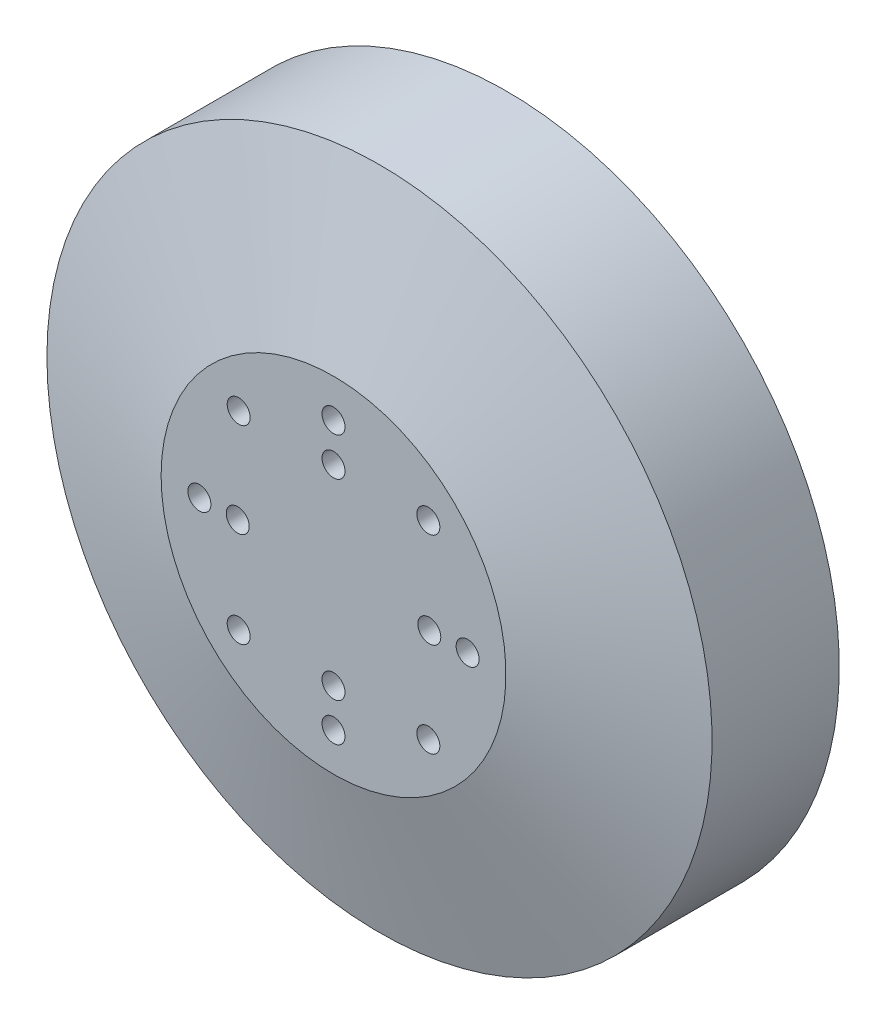
ISO-10303-21;
HEADER;
FILE_DESCRIPTION(('STEP AP214'),'2;1');
FILE_NAME('part.step','',(''),(''),'','','');
FILE_SCHEMA(('AUTOMOTIVE_DESIGN { 1 0 10303 214 1 1 1 1 }'));
ENDSEC;
DATA;
#1=APPLICATION_CONTEXT('core data for automotive mechanical design processes');
#2=APPLICATION_PROTOCOL_DEFINITION('international standard','automotive_design',2000,#1);
#3=PRODUCT_CONTEXT('',#1,'mechanical');
#4=PRODUCT('Part','Part','',(#3));
#5=PRODUCT_RELATED_PRODUCT_CATEGORY('part','',(#4));
#6=PRODUCT_DEFINITION_FORMATION('','',#4);
#7=PRODUCT_DEFINITION_CONTEXT('part definition',#1,'design');
#8=PRODUCT_DEFINITION('design','',#6,#7);
#9=PRODUCT_DEFINITION_SHAPE('','',#8);
#10=(LENGTH_UNIT() NAMED_UNIT(*) SI_UNIT(.MILLI.,.METRE.));
#11=(NAMED_UNIT(*) PLANE_ANGLE_UNIT() SI_UNIT($,.RADIAN.));
#12=(NAMED_UNIT(*) SI_UNIT($,.STERADIAN.) SOLID_ANGLE_UNIT());
#13=UNCERTAINTY_MEASURE_WITH_UNIT(LENGTH_MEASURE(1.E-05),#10,'distance_accuracy_value','');
#14=(GEOMETRIC_REPRESENTATION_CONTEXT(3) GLOBAL_UNCERTAINTY_ASSIGNED_CONTEXT((#13)) GLOBAL_UNIT_ASSIGNED_CONTEXT((#10,
#11,#12)) REPRESENTATION_CONTEXT('',''));
#15=CARTESIAN_POINT('',(0.,0.,0.));
#16=DIRECTION('',(0.,0.,1.));
#17=DIRECTION('',(1.,0.,0.));
#18=AXIS2_PLACEMENT_3D('',#15,#16,#17);
#19=CARTESIAN_POINT('',(-40.4,0.,-9.29999999999999));
#20=DIRECTION('',(0.,0.,1.));
#21=DIRECTION('',(1.,0.,0.));
#22=AXIS2_PLACEMENT_3D('',#19,#20,#21);
#23=PLANE('',#22);
#24=CARTESIAN_POINT('',(0.,0.,-9.29999999999999));
#25=DIRECTION('',(0.,0.,-1.));
#26=DIRECTION('',(-1.,0.,0.));
#27=AXIS2_PLACEMENT_3D('',#24,#25,#26);
#28=CIRCLE('',#27,40.4);
#29=CARTESIAN_POINT('',(-40.4,0.,-9.29999999999999));
#30=VERTEX_POINT('',#29);
#31=EDGE_CURVE('E47',#30,#30,#28,.T.);
#32=ORIENTED_EDGE('',*,*,#31,.F.);
#33=EDGE_LOOP('',(#32));
#34=FACE_BOUND('',#33,.T.);
#35=CARTESIAN_POINT('',(0.,0.,-9.29999999999999));
#36=DIRECTION('',(0.,0.,-1.));
#37=DIRECTION('',(-1.,0.,0.));
#38=AXIS2_PLACEMENT_3D('',#35,#36,#37);
#39=CIRCLE('',#38,43.4);
#40=CARTESIAN_POINT('',(-43.4,0.,-9.29999999999999));
#41=VERTEX_POINT('',#40);
#42=EDGE_CURVE('E35',#41,#41,#39,.T.);
#43=ORIENTED_EDGE('',*,*,#42,.T.);
#44=EDGE_LOOP('',(#43));
#45=FACE_BOUND('',#44,.T.);
#46=ADVANCED_FACE('F31',(#34,#45),#23,.F.);
#47=CARTESIAN_POINT('',(0.,0.,-10.8));
#48=DIRECTION('',(0.,0.,1.));
#49=DIRECTION('',(1.,0.,0.));
#50=AXIS2_PLACEMENT_3D('',#47,#48,#49);
#51=CONICAL_SURFACE('',#50,40.4,1.44885532876603);
#52=CARTESIAN_POINT('',(0.,0.,-13.3));
#53=DIRECTION('',(0.,0.,-1.));
#54=DIRECTION('',(-1.,0.,0.));
#55=AXIS2_PLACEMENT_3D('',#52,#53,#54);
#56=CIRCLE('',#55,20.);
#57=CARTESIAN_POINT('',(-20.,0.,-13.3));
#58=VERTEX_POINT('',#57);
#59=EDGE_CURVE('E53',#58,#58,#56,.T.);
#60=ORIENTED_EDGE('',*,*,#59,.F.);
#61=EDGE_LOOP('',(#60));
#62=FACE_BOUND('',#61,.T.);
#63=CARTESIAN_POINT('',(0.,0.,-10.8));
#64=DIRECTION('',(0.,0.,-1.));
#65=DIRECTION('',(-1.,0.,0.));
#66=AXIS2_PLACEMENT_3D('',#63,#64,#65);
#67=CIRCLE('',#66,40.4);
#68=CARTESIAN_POINT('',(-40.4,0.,-10.8));
#69=VERTEX_POINT('',#68);
#70=EDGE_CURVE('E50',#69,#69,#67,.T.);
#71=ORIENTED_EDGE('',*,*,#70,.T.);
#72=EDGE_LOOP('',(#71));
#73=FACE_BOUND('',#72,.T.);
#74=ADVANCED_FACE('F75',(#62,#73),#51,.T.);
#75=CARTESIAN_POINT('',(0.,0.,-13.3));
#76=DIRECTION('',(0.,0.,-1.));
#77=DIRECTION('',(-1.,0.,0.));
#78=AXIS2_PLACEMENT_3D('',#75,#76,#77);
#79=CYLINDRICAL_SURFACE('',#78,40.4);
#80=ORIENTED_EDGE('',*,*,#70,.F.);
#81=EDGE_LOOP('',(#80));
#82=FACE_BOUND('',#81,.T.);
#83=ORIENTED_EDGE('',*,*,#31,.T.);
#84=EDGE_LOOP('',(#83));
#85=FACE_BOUND('',#84,.T.);
#86=ADVANCED_FACE('F72',(#82,#85),#79,.T.);
#87=CARTESIAN_POINT('',(0.,0.,-13.3));
#88=DIRECTION('',(0.,0.,1.));
#89=DIRECTION('',(1.,0.,0.));
#90=AXIS2_PLACEMENT_3D('',#87,#88,#89);
#91=PLANE('',#90);
#92=CARTESIAN_POINT('',(-10.6066017177982,-10.6066017177982,-13.3));
#93=DIRECTION('',(0.,0.,-1.));
#94=DIRECTION('',(-1.,0.,0.));
#95=AXIS2_PLACEMENT_3D('',#92,#93,#94);
#96=CIRCLE('',#95,1.5);
#97=CARTESIAN_POINT('',(-12.1066017177982,-10.6066017177982,-13.3));
#98=VERTEX_POINT('',#97);
#99=EDGE_CURVE('E194',#98,#98,#96,.T.);
#100=ORIENTED_EDGE('',*,*,#99,.F.);
#101=EDGE_LOOP('',(#100));
#102=FACE_BOUND('',#101,.T.);
#103=CARTESIAN_POINT('',(10.6066017177982,-10.6066017177982,-13.3));
#104=DIRECTION('',(0.,0.,-1.));
#105=DIRECTION('',(-1.,0.,0.));
#106=AXIS2_PLACEMENT_3D('',#103,#104,#105);
#107=CIRCLE('',#106,1.5);
#108=CARTESIAN_POINT('',(9.10660171779821,-10.6066017177982,-13.3));
#109=VERTEX_POINT('',#108);
#110=EDGE_CURVE('E200',#109,#109,#107,.T.);
#111=ORIENTED_EDGE('',*,*,#110,.F.);
#112=EDGE_LOOP('',(#111));
#113=FACE_BOUND('',#112,.T.);
#114=CARTESIAN_POINT('',(10.6066017177982,10.6066017177982,-13.3));
#115=DIRECTION('',(0.,0.,-1.));
#116=DIRECTION('',(-1.,0.,0.));
#117=AXIS2_PLACEMENT_3D('',#114,#115,#116);
#118=CIRCLE('',#117,1.5);
#119=CARTESIAN_POINT('',(9.10660171779821,10.6066017177982,-13.3));
#120=VERTEX_POINT('',#119);
#121=EDGE_CURVE('E206',#120,#120,#118,.T.);
#122=ORIENTED_EDGE('',*,*,#121,.F.);
#123=EDGE_LOOP('',(#122));
#124=FACE_BOUND('',#123,.T.);
#125=CARTESIAN_POINT('',(0.,16.,-13.3));
#126=DIRECTION('',(0.,0.,-1.));
#127=DIRECTION('',(-1.,0.,0.));
#128=AXIS2_PLACEMENT_3D('',#125,#126,#127);
#129=CIRCLE('',#128,2.);
#130=CARTESIAN_POINT('',(-2.,16.,-13.3));
#131=VERTEX_POINT('',#130);
#132=EDGE_CURVE('E173',#131,#131,#129,.T.);
#133=ORIENTED_EDGE('',*,*,#132,.F.);
#134=EDGE_LOOP('',(#133));
#135=FACE_BOUND('',#134,.T.);
#136=CARTESIAN_POINT('',(-16.,0.,-13.3));
#137=DIRECTION('',(0.,0.,-1.));
#138=DIRECTION('',(-1.,0.,0.));
#139=AXIS2_PLACEMENT_3D('',#136,#137,#138);
#140=CIRCLE('',#139,2.);
#141=CARTESIAN_POINT('',(-18.,0.,-13.3));
#142=VERTEX_POINT('',#141);
#143=EDGE_CURVE('E174',#142,#142,#140,.T.);
#144=ORIENTED_EDGE('',*,*,#143,.F.);
#145=EDGE_LOOP('',(#144));
#146=FACE_BOUND('',#145,.T.);
#147=CARTESIAN_POINT('',(0.,-16.,-13.3));
#148=DIRECTION('',(0.,0.,-1.));
#149=DIRECTION('',(-1.,0.,0.));
#150=AXIS2_PLACEMENT_3D('',#147,#148,#149);
#151=CIRCLE('',#150,2.);
#152=CARTESIAN_POINT('',(-2.,-16.,-13.3));
#153=VERTEX_POINT('',#152);
#154=EDGE_CURVE('E180',#153,#153,#151,.T.);
#155=ORIENTED_EDGE('',*,*,#154,.F.);
#156=EDGE_LOOP('',(#155));
#157=FACE_BOUND('',#156,.T.);
#158=CARTESIAN_POINT('',(16.,0.,-13.3));
#159=DIRECTION('',(0.,0.,-1.));
#160=DIRECTION('',(-1.,0.,0.));
#161=AXIS2_PLACEMENT_3D('',#158,#159,#160);
#162=CIRCLE('',#161,2.);
#163=CARTESIAN_POINT('',(14.,0.,-13.3));
#164=VERTEX_POINT('',#163);
#165=EDGE_CURVE('E186',#164,#164,#162,.T.);
#166=ORIENTED_EDGE('',*,*,#165,.F.);
#167=EDGE_LOOP('',(#166));
#168=FACE_BOUND('',#167,.T.);
#169=CARTESIAN_POINT('',(-10.6066017177982,10.6066017177982,-13.3));
#170=DIRECTION('',(0.,0.,-1.));
#171=DIRECTION('',(-1.,0.,0.));
#172=AXIS2_PLACEMENT_3D('',#169,#170,#171);
#173=CIRCLE('',#172,1.5);
#174=CARTESIAN_POINT('',(-12.1066017177982,10.6066017177982,-13.3));
#175=VERTEX_POINT('',#174);
#176=EDGE_CURVE('E193',#175,#175,#173,.T.);
#177=ORIENTED_EDGE('',*,*,#176,.F.);
#178=EDGE_LOOP('',(#177));
#179=FACE_BOUND('',#178,.T.);
#180=ORIENTED_EDGE('',*,*,#59,.T.);
#181=EDGE_LOOP('',(#180));
#182=FACE_BOUND('',#181,.T.);
#183=ADVANCED_FACE('F63',(#102,#113,#124,#135,#146,#157,#168,#179,#182),#91,.F.);
#184=CARTESIAN_POINT('',(0.,0.,13.3));
#185=DIRECTION('',(0.,0.,-1.));
#186=DIRECTION('',(-1.,0.,0.));
#187=AXIS2_PLACEMENT_3D('',#184,#185,#186);
#188=CYLINDRICAL_SURFACE('',#187,43.4);
#189=CARTESIAN_POINT('',(0.,0.,7.3));
#190=DIRECTION('',(0.,0.,-1.));
#191=DIRECTION('',(-1.,0.,0.));
#192=AXIS2_PLACEMENT_3D('',#189,#190,#191);
#193=CIRCLE('',#192,43.4);
#194=CARTESIAN_POINT('',(-43.4,0.,7.3));
#195=VERTEX_POINT('',#194);
#196=EDGE_CURVE('E39',#195,#195,#193,.T.);
#197=ORIENTED_EDGE('',*,*,#196,.T.);
#198=EDGE_LOOP('',(#197));
#199=FACE_BOUND('',#198,.T.);
#200=ORIENTED_EDGE('',*,*,#42,.F.);
#201=EDGE_LOOP('',(#200));
#202=FACE_BOUND('',#201,.T.);
#203=ADVANCED_FACE('F33',(#199,#202),#188,.T.);
#204=CARTESIAN_POINT('',(0.,0.,13.3));
#205=DIRECTION('',(0.,0.,-1.));
#206=DIRECTION('',(-1.,0.,0.));
#207=AXIS2_PLACEMENT_3D('',#204,#205,#206);
#208=CONICAL_SURFACE('',#207,22.5,1.29123324458332);
#209=ORIENTED_EDGE('',*,*,#196,.F.);
#210=EDGE_LOOP('',(#209));
#211=FACE_BOUND('',#210,.T.);
#212=CARTESIAN_POINT('',(0.,0.,13.3));
#213=DIRECTION('',(0.,0.,-1.));
#214=DIRECTION('',(-1.,0.,0.));
#215=AXIS2_PLACEMENT_3D('',#212,#213,#214);
#216=CIRCLE('',#215,22.5);
#217=CARTESIAN_POINT('',(-22.5,0.,13.3));
#218=VERTEX_POINT('',#217);
#219=EDGE_CURVE('E10',#218,#218,#216,.T.);
#220=ORIENTED_EDGE('',*,*,#219,.T.);
#221=EDGE_LOOP('',(#220));
#222=FACE_BOUND('',#221,.T.);
#223=ADVANCED_FACE('F62',(#211,#222),#208,.T.);
#224=CARTESIAN_POINT('',(0.,0.,13.3));
#225=DIRECTION('',(0.,0.,1.));
#226=DIRECTION('',(1.,0.,0.));
#227=AXIS2_PLACEMENT_3D('',#224,#225,#226);
#228=PLANE('',#227);
#229=CARTESIAN_POINT('',(0.,17.5,13.3));
#230=DIRECTION('',(0.,0.,1.));
#231=DIRECTION('',(1.,0.,0.));
#232=AXIS2_PLACEMENT_3D('',#229,#230,#231);
#233=CIRCLE('',#232,1.5);
#234=CARTESIAN_POINT('',(1.5,17.5,13.3));
#235=VERTEX_POINT('',#234);
#236=EDGE_CURVE('E98',#235,#235,#233,.T.);
#237=ORIENTED_EDGE('',*,*,#236,.F.);
#238=EDGE_LOOP('',(#237));
#239=FACE_BOUND('',#238,.T.);
#240=CARTESIAN_POINT('',(-12.5,0.,13.3));
#241=DIRECTION('',(0.,0.,1.));
#242=DIRECTION('',(1.,0.,0.));
#243=AXIS2_PLACEMENT_3D('',#240,#241,#242);
#244=CIRCLE('',#243,1.50000000000023);
#245=CARTESIAN_POINT('',(-10.9999999999998,0.,13.3));
#246=VERTEX_POINT('',#245);
#247=EDGE_CURVE('E102',#246,#246,#244,.T.);
#248=ORIENTED_EDGE('',*,*,#247,.F.);
#249=EDGE_LOOP('',(#248));
#250=FACE_BOUND('',#249,.T.);
#251=CARTESIAN_POINT('',(0.,-12.5,13.3));
#252=DIRECTION('',(0.,0.,1.));
#253=DIRECTION('',(1.,0.,0.));
#254=AXIS2_PLACEMENT_3D('',#251,#252,#253);
#255=CIRCLE('',#254,1.50000000000068);
#256=CARTESIAN_POINT('',(1.50000000000068,-12.5,13.3));
#257=VERTEX_POINT('',#256);
#258=EDGE_CURVE('E106',#257,#257,#255,.T.);
#259=ORIENTED_EDGE('',*,*,#258,.F.);
#260=EDGE_LOOP('',(#259));
#261=FACE_BOUND('',#260,.T.);
#262=CARTESIAN_POINT('',(12.5,0.,13.3));
#263=DIRECTION('',(0.,0.,1.));
#264=DIRECTION('',(1.,0.,0.));
#265=AXIS2_PLACEMENT_3D('',#262,#263,#264);
#266=CIRCLE('',#265,1.50000000000044);
#267=CARTESIAN_POINT('',(14.0000000000004,0.,13.3));
#268=VERTEX_POINT('',#267);
#269=EDGE_CURVE('E110',#268,#268,#266,.T.);
#270=ORIENTED_EDGE('',*,*,#269,.F.);
#271=EDGE_LOOP('',(#270));
#272=FACE_BOUND('',#271,.T.);
#273=CARTESIAN_POINT('',(0.,12.5,13.3));
#274=DIRECTION('',(0.,0.,1.));
#275=DIRECTION('',(1.,0.,0.));
#276=AXIS2_PLACEMENT_3D('',#273,#274,#275);
#277=CIRCLE('',#276,1.5);
#278=CARTESIAN_POINT('',(1.5,12.5,13.3));
#279=VERTEX_POINT('',#278);
#280=EDGE_CURVE('E114',#279,#279,#277,.T.);
#281=ORIENTED_EDGE('',*,*,#280,.F.);
#282=EDGE_LOOP('',(#281));
#283=FACE_BOUND('',#282,.T.);
#284=CARTESIAN_POINT('',(12.3743686707646,12.3743686707646,13.3));
#285=DIRECTION('',(0.,0.,1.));
#286=DIRECTION('',(1.,0.,0.));
#287=AXIS2_PLACEMENT_3D('',#284,#285,#286);
#288=CIRCLE('',#287,1.50000000000036);
#289=CARTESIAN_POINT('',(13.8743686707649,12.3743686707646,13.3));
#290=VERTEX_POINT('',#289);
#291=EDGE_CURVE('E118',#290,#290,#288,.T.);
#292=ORIENTED_EDGE('',*,*,#291,.F.);
#293=EDGE_LOOP('',(#292));
#294=FACE_BOUND('',#293,.T.);
#295=CARTESIAN_POINT('',(17.5,0.,13.3));
#296=DIRECTION('',(0.,0.,1.));
#297=DIRECTION('',(1.,0.,0.));
#298=AXIS2_PLACEMENT_3D('',#295,#296,#297);
#299=CIRCLE('',#298,1.50000000000093);
#300=CARTESIAN_POINT('',(19.0000000000009,0.,13.3));
#301=VERTEX_POINT('',#300);
#302=EDGE_CURVE('E122',#301,#301,#299,.T.);
#303=ORIENTED_EDGE('',*,*,#302,.F.);
#304=EDGE_LOOP('',(#303));
#305=FACE_BOUND('',#304,.T.);
#306=CARTESIAN_POINT('',(12.3743686707646,-12.3743686707646,13.3));
#307=DIRECTION('',(0.,0.,1.));
#308=DIRECTION('',(1.,0.,0.));
#309=AXIS2_PLACEMENT_3D('',#306,#307,#308);
#310=CIRCLE('',#309,1.50000000000136);
#311=CARTESIAN_POINT('',(13.8743686707659,-12.3743686707646,13.3));
#312=VERTEX_POINT('',#311);
#313=EDGE_CURVE('E126',#312,#312,#310,.T.);
#314=ORIENTED_EDGE('',*,*,#313,.F.);
#315=EDGE_LOOP('',(#314));
#316=FACE_BOUND('',#315,.T.);
#317=CARTESIAN_POINT('',(0.,-17.5,13.3));
#318=DIRECTION('',(0.,0.,1.));
#319=DIRECTION('',(1.,0.,0.));
#320=AXIS2_PLACEMENT_3D('',#317,#318,#319);
#321=CIRCLE('',#320,1.50000000000142);
#322=CARTESIAN_POINT('',(1.50000000000142,-17.5,13.3));
#323=VERTEX_POINT('',#322);
#324=EDGE_CURVE('E130',#323,#323,#321,.T.);
#325=ORIENTED_EDGE('',*,*,#324,.F.);
#326=EDGE_LOOP('',(#325));
#327=FACE_BOUND('',#326,.T.);
#328=CARTESIAN_POINT('',(-12.3743686707646,-12.3743686707646,13.3));
#329=DIRECTION('',(0.,0.,1.));
#330=DIRECTION('',(1.,0.,0.));
#331=AXIS2_PLACEMENT_3D('',#328,#329,#330);
#332=CIRCLE('',#331,1.50000000000106);
#333=CARTESIAN_POINT('',(-10.8743686707635,-12.3743686707646,13.3));
#334=VERTEX_POINT('',#333);
#335=EDGE_CURVE('E134',#334,#334,#332,.T.);
#336=ORIENTED_EDGE('',*,*,#335,.F.);
#337=EDGE_LOOP('',(#336));
#338=FACE_BOUND('',#337,.T.);
#339=CARTESIAN_POINT('',(-17.5,0.,13.3));
#340=DIRECTION('',(0.,0.,1.));
#341=DIRECTION('',(1.,0.,0.));
#342=AXIS2_PLACEMENT_3D('',#339,#340,#341);
#343=CIRCLE('',#342,1.50000000000049);
#344=CARTESIAN_POINT('',(-15.9999999999995,0.,13.3));
#345=VERTEX_POINT('',#344);
#346=EDGE_CURVE('E138',#345,#345,#343,.T.);
#347=ORIENTED_EDGE('',*,*,#346,.F.);
#348=EDGE_LOOP('',(#347));
#349=FACE_BOUND('',#348,.T.);
#350=CARTESIAN_POINT('',(-12.3743686707646,12.3743686707646,13.3));
#351=DIRECTION('',(0.,0.,1.));
#352=DIRECTION('',(1.,0.,0.));
#353=AXIS2_PLACEMENT_3D('',#350,#351,#352);
#354=CIRCLE('',#353,1.50000000000006);
#355=CARTESIAN_POINT('',(-10.8743686707645,12.3743686707646,13.3));
#356=VERTEX_POINT('',#355);
#357=EDGE_CURVE('E142',#356,#356,#354,.T.);
#358=ORIENTED_EDGE('',*,*,#357,.F.);
#359=EDGE_LOOP('',(#358));
#360=FACE_BOUND('',#359,.T.);
#361=ORIENTED_EDGE('',*,*,#219,.F.);
#362=EDGE_LOOP('',(#361));
#363=FACE_BOUND('',#362,.T.);
#364=ADVANCED_FACE('F69',(#239,#250,#261,#272,#283,#294,#305,#316,#327,#338,#349,#360,#363),
#228,.T.);
#365=CARTESIAN_POINT('',(-10.6066017177982,10.6066017177982,-3.3));
#366=DIRECTION('',(0.,0.,-1.));
#367=DIRECTION('',(-1.,0.,0.));
#368=AXIS2_PLACEMENT_3D('',#365,#366,#367);
#369=CYLINDRICAL_SURFACE('',#368,1.5);
#370=CARTESIAN_POINT('',(-10.6066017177982,10.6066017177982,-3.3));
#371=DIRECTION('',(0.,0.,-1.));
#372=DIRECTION('',(-1.,0.,0.));
#373=AXIS2_PLACEMENT_3D('',#370,#371,#372);
#374=CIRCLE('',#373,1.5);
#375=CARTESIAN_POINT('',(-12.1066017177982,10.6066017177982,-3.3));
#376=VERTEX_POINT('',#375);
#377=EDGE_CURVE('E51',#376,#376,#374,.T.);
#378=ORIENTED_EDGE('',*,*,#377,.F.);
#379=EDGE_LOOP('',(#378));
#380=FACE_BOUND('',#379,.T.);
#381=ORIENTED_EDGE('',*,*,#176,.T.);
#382=EDGE_LOOP('',(#381));
#383=FACE_BOUND('',#382,.T.);
#384=ADVANCED_FACE('F87',(#380,#383),#369,.F.);
#385=CARTESIAN_POINT('',(-10.6066017177982,10.6066017177982,-3.3));
#386=DIRECTION('',(0.,0.,-1.));
#387=DIRECTION('',(-1.,0.,0.));
#388=AXIS2_PLACEMENT_3D('',#385,#386,#387);
#389=PLANE('',#388);
#390=ORIENTED_EDGE('',*,*,#377,.T.);
#391=EDGE_LOOP('',(#390));
#392=FACE_BOUND('',#391,.T.);
#393=ADVANCED_FACE('F92',(#392),#389,.T.);
#394=CARTESIAN_POINT('',(16.,0.,-3.3));
#395=DIRECTION('',(0.,0.,-1.));
#396=DIRECTION('',(-1.,0.,0.));
#397=AXIS2_PLACEMENT_3D('',#394,#395,#396);
#398=CYLINDRICAL_SURFACE('',#397,2.);
#399=CARTESIAN_POINT('',(16.,0.,-3.3));
#400=DIRECTION('',(0.,0.,-1.));
#401=DIRECTION('',(-1.,0.,0.));
#402=AXIS2_PLACEMENT_3D('',#399,#400,#401);
#403=CIRCLE('',#402,2.);
#404=CARTESIAN_POINT('',(14.,0.,-3.3));
#405=VERTEX_POINT('',#404);
#406=EDGE_CURVE('E183',#405,#405,#403,.T.);
#407=ORIENTED_EDGE('',*,*,#406,.F.);
#408=EDGE_LOOP('',(#407));
#409=FACE_BOUND('',#408,.T.);
#410=ORIENTED_EDGE('',*,*,#165,.T.);
#411=EDGE_LOOP('',(#410));
#412=FACE_BOUND('',#411,.T.);
#413=ADVANCED_FACE('F222',(#409,#412),#398,.F.);
#414=CARTESIAN_POINT('',(16.,0.,-3.3));
#415=DIRECTION('',(0.,0.,-1.));
#416=DIRECTION('',(-1.,0.,0.));
#417=AXIS2_PLACEMENT_3D('',#414,#415,#416);
#418=PLANE('',#417);
#419=ORIENTED_EDGE('',*,*,#406,.T.);
#420=EDGE_LOOP('',(#419));
#421=FACE_BOUND('',#420,.T.);
#422=ADVANCED_FACE('F227',(#421),#418,.T.);
#423=CARTESIAN_POINT('',(0.,-16.,-3.3));
#424=DIRECTION('',(0.,0.,-1.));
#425=DIRECTION('',(-1.,0.,0.));
#426=AXIS2_PLACEMENT_3D('',#423,#424,#425);
#427=CYLINDRICAL_SURFACE('',#426,2.);
#428=CARTESIAN_POINT('',(0.,-16.,-3.3));
#429=DIRECTION('',(0.,0.,-1.));
#430=DIRECTION('',(-1.,0.,0.));
#431=AXIS2_PLACEMENT_3D('',#428,#429,#430);
#432=CIRCLE('',#431,2.);
#433=CARTESIAN_POINT('',(-2.,-16.,-3.3));
#434=VERTEX_POINT('',#433);
#435=EDGE_CURVE('E177',#434,#434,#432,.T.);
#436=ORIENTED_EDGE('',*,*,#435,.F.);
#437=EDGE_LOOP('',(#436));
#438=FACE_BOUND('',#437,.T.);
#439=ORIENTED_EDGE('',*,*,#154,.T.);
#440=EDGE_LOOP('',(#439));
#441=FACE_BOUND('',#440,.T.);
#442=ADVANCED_FACE('F276',(#438,#441),#427,.F.);
#443=CARTESIAN_POINT('',(0.,-16.,-3.3));
#444=DIRECTION('',(0.,0.,-1.));
#445=DIRECTION('',(-1.,0.,0.));
#446=AXIS2_PLACEMENT_3D('',#443,#444,#445);
#447=PLANE('',#446);
#448=ORIENTED_EDGE('',*,*,#435,.T.);
#449=EDGE_LOOP('',(#448));
#450=FACE_BOUND('',#449,.T.);
#451=ADVANCED_FACE('F286',(#450),#447,.T.);
#452=CARTESIAN_POINT('',(-16.,0.,-3.3));
#453=DIRECTION('',(0.,0.,-1.));
#454=DIRECTION('',(-1.,0.,0.));
#455=AXIS2_PLACEMENT_3D('',#452,#453,#454);
#456=CYLINDRICAL_SURFACE('',#455,2.);
#457=CARTESIAN_POINT('',(-16.,0.,-3.3));
#458=DIRECTION('',(0.,0.,-1.));
#459=DIRECTION('',(-1.,0.,0.));
#460=AXIS2_PLACEMENT_3D('',#457,#458,#459);
#461=CIRCLE('',#460,2.);
#462=CARTESIAN_POINT('',(-18.,0.,-3.3));
#463=VERTEX_POINT('',#462);
#464=EDGE_CURVE('E170',#463,#463,#461,.T.);
#465=ORIENTED_EDGE('',*,*,#464,.F.);
#466=EDGE_LOOP('',(#465));
#467=FACE_BOUND('',#466,.T.);
#468=ORIENTED_EDGE('',*,*,#143,.T.);
#469=EDGE_LOOP('',(#468));
#470=FACE_BOUND('',#469,.T.);
#471=ADVANCED_FACE('F296',(#467,#470),#456,.F.);
#472=CARTESIAN_POINT('',(-16.,0.,-3.3));
#473=DIRECTION('',(0.,0.,-1.));
#474=DIRECTION('',(-1.,0.,0.));
#475=AXIS2_PLACEMENT_3D('',#472,#473,#474);
#476=PLANE('',#475);
#477=ORIENTED_EDGE('',*,*,#464,.T.);
#478=EDGE_LOOP('',(#477));
#479=FACE_BOUND('',#478,.T.);
#480=ADVANCED_FACE('F306',(#479),#476,.T.);
#481=CARTESIAN_POINT('',(0.,16.,-3.3));
#482=DIRECTION('',(0.,0.,-1.));
#483=DIRECTION('',(-1.,0.,0.));
#484=AXIS2_PLACEMENT_3D('',#481,#482,#483);
#485=CYLINDRICAL_SURFACE('',#484,2.);
#486=CARTESIAN_POINT('',(0.,16.,-3.3));
#487=DIRECTION('',(0.,0.,-1.));
#488=DIRECTION('',(-1.,0.,0.));
#489=AXIS2_PLACEMENT_3D('',#486,#487,#488);
#490=CIRCLE('',#489,2.);
#491=CARTESIAN_POINT('',(-2.,16.,-3.3));
#492=VERTEX_POINT('',#491);
#493=EDGE_CURVE('E209',#492,#492,#490,.T.);
#494=ORIENTED_EDGE('',*,*,#493,.F.);
#495=EDGE_LOOP('',(#494));
#496=FACE_BOUND('',#495,.T.);
#497=ORIENTED_EDGE('',*,*,#132,.T.);
#498=EDGE_LOOP('',(#497));
#499=FACE_BOUND('',#498,.T.);
#500=ADVANCED_FACE('F231',(#496,#499),#485,.F.);
#501=CARTESIAN_POINT('',(0.,16.,-3.3));
#502=DIRECTION('',(0.,0.,-1.));
#503=DIRECTION('',(-1.,0.,0.));
#504=AXIS2_PLACEMENT_3D('',#501,#502,#503);
#505=PLANE('',#504);
#506=ORIENTED_EDGE('',*,*,#493,.T.);
#507=EDGE_LOOP('',(#506));
#508=FACE_BOUND('',#507,.T.);
#509=ADVANCED_FACE('F325',(#508),#505,.T.);
#510=CARTESIAN_POINT('',(10.6066017177982,10.6066017177982,-3.3));
#511=DIRECTION('',(0.,0.,-1.));
#512=DIRECTION('',(-1.,0.,0.));
#513=AXIS2_PLACEMENT_3D('',#510,#511,#512);
#514=CYLINDRICAL_SURFACE('',#513,1.5);
#515=CARTESIAN_POINT('',(10.6066017177982,10.6066017177982,-3.3));
#516=DIRECTION('',(0.,0.,-1.));
#517=DIRECTION('',(-1.,0.,0.));
#518=AXIS2_PLACEMENT_3D('',#515,#516,#517);
#519=CIRCLE('',#518,1.5);
#520=CARTESIAN_POINT('',(9.10660171779821,10.6066017177982,-3.3));
#521=VERTEX_POINT('',#520);
#522=EDGE_CURVE('E203',#521,#521,#519,.T.);
#523=ORIENTED_EDGE('',*,*,#522,.F.);
#524=EDGE_LOOP('',(#523));
#525=FACE_BOUND('',#524,.T.);
#526=ORIENTED_EDGE('',*,*,#121,.T.);
#527=EDGE_LOOP('',(#526));
#528=FACE_BOUND('',#527,.T.);
#529=ADVANCED_FACE('F334',(#525,#528),#514,.F.);
#530=CARTESIAN_POINT('',(10.6066017177982,10.6066017177982,-3.3));
#531=DIRECTION('',(0.,0.,-1.));
#532=DIRECTION('',(-1.,0.,0.));
#533=AXIS2_PLACEMENT_3D('',#530,#531,#532);
#534=PLANE('',#533);
#535=ORIENTED_EDGE('',*,*,#522,.T.);
#536=EDGE_LOOP('',(#535));
#537=FACE_BOUND('',#536,.T.);
#538=ADVANCED_FACE('F343',(#537),#534,.T.);
#539=CARTESIAN_POINT('',(10.6066017177982,-10.6066017177982,-3.3));
#540=DIRECTION('',(0.,0.,-1.));
#541=DIRECTION('',(-1.,0.,0.));
#542=AXIS2_PLACEMENT_3D('',#539,#540,#541);
#543=CYLINDRICAL_SURFACE('',#542,1.5);
#544=CARTESIAN_POINT('',(10.6066017177982,-10.6066017177982,-3.3));
#545=DIRECTION('',(0.,0.,-1.));
#546=DIRECTION('',(-1.,0.,0.));
#547=AXIS2_PLACEMENT_3D('',#544,#545,#546);
#548=CIRCLE('',#547,1.5);
#549=CARTESIAN_POINT('',(9.10660171779821,-10.6066017177982,-3.3));
#550=VERTEX_POINT('',#549);
#551=EDGE_CURVE('E197',#550,#550,#548,.T.);
#552=ORIENTED_EDGE('',*,*,#551,.F.);
#553=EDGE_LOOP('',(#552));
#554=FACE_BOUND('',#553,.T.);
#555=ORIENTED_EDGE('',*,*,#110,.T.);
#556=EDGE_LOOP('',(#555));
#557=FACE_BOUND('',#556,.T.);
#558=ADVANCED_FACE('F353',(#554,#557),#543,.F.);
#559=CARTESIAN_POINT('',(10.6066017177982,-10.6066017177982,-3.3));
#560=DIRECTION('',(0.,0.,-1.));
#561=DIRECTION('',(-1.,0.,0.));
#562=AXIS2_PLACEMENT_3D('',#559,#560,#561);
#563=PLANE('',#562);
#564=ORIENTED_EDGE('',*,*,#551,.T.);
#565=EDGE_LOOP('',(#564));
#566=FACE_BOUND('',#565,.T.);
#567=ADVANCED_FACE('F363',(#566),#563,.T.);
#568=CARTESIAN_POINT('',(-10.6066017177982,-10.6066017177982,-3.3));
#569=DIRECTION('',(0.,0.,-1.));
#570=DIRECTION('',(-1.,0.,0.));
#571=AXIS2_PLACEMENT_3D('',#568,#569,#570);
#572=CYLINDRICAL_SURFACE('',#571,1.5);
#573=CARTESIAN_POINT('',(-10.6066017177982,-10.6066017177982,-3.3));
#574=DIRECTION('',(0.,0.,-1.));
#575=DIRECTION('',(-1.,0.,0.));
#576=AXIS2_PLACEMENT_3D('',#573,#574,#575);
#577=CIRCLE('',#576,1.5);
#578=CARTESIAN_POINT('',(-12.1066017177982,-10.6066017177982,-3.3));
#579=VERTEX_POINT('',#578);
#580=EDGE_CURVE('E190',#579,#579,#577,.T.);
#581=ORIENTED_EDGE('',*,*,#580,.F.);
#582=EDGE_LOOP('',(#581));
#583=FACE_BOUND('',#582,.T.);
#584=ORIENTED_EDGE('',*,*,#99,.T.);
#585=EDGE_LOOP('',(#584));
#586=FACE_BOUND('',#585,.T.);
#587=ADVANCED_FACE('F373',(#583,#586),#572,.F.);
#588=CARTESIAN_POINT('',(-10.6066017177982,-10.6066017177982,-3.3));
#589=DIRECTION('',(0.,0.,-1.));
#590=DIRECTION('',(-1.,0.,0.));
#591=AXIS2_PLACEMENT_3D('',#588,#589,#590);
#592=PLANE('',#591);
#593=ORIENTED_EDGE('',*,*,#580,.T.);
#594=EDGE_LOOP('',(#593));
#595=FACE_BOUND('',#594,.T.);
#596=ADVANCED_FACE('F383',(#595),#592,.T.);
#597=CARTESIAN_POINT('',(-12.3743686707646,12.3743686707646,8.3));
#598=DIRECTION('',(0.,0.,1.));
#599=DIRECTION('',(1.,0.,0.));
#600=AXIS2_PLACEMENT_3D('',#597,#598,#599);
#601=CYLINDRICAL_SURFACE('',#600,1.50000000000006);
#602=CARTESIAN_POINT('',(-12.3743686707646,12.3743686707646,8.3));
#603=DIRECTION('',(0.,0.,1.));
#604=DIRECTION('',(1.,0.,0.));
#605=AXIS2_PLACEMENT_3D('',#602,#603,#604);
#606=CIRCLE('',#605,1.50000000000006);
#607=CARTESIAN_POINT('',(-10.8743686707645,12.3743686707646,8.3));
#608=VERTEX_POINT('',#607);
#609=EDGE_CURVE('E144',#608,#608,#606,.T.);
#610=ORIENTED_EDGE('',*,*,#609,.F.);
#611=EDGE_LOOP('',(#610));
#612=FACE_BOUND('',#611,.T.);
#613=ORIENTED_EDGE('',*,*,#357,.T.);
#614=EDGE_LOOP('',(#613));
#615=FACE_BOUND('',#614,.T.);
#616=ADVANCED_FACE('F392',(#612,#615),#601,.F.);
#617=CARTESIAN_POINT('',(-12.3743686707646,12.3743686707646,8.3));
#618=DIRECTION('',(0.,0.,1.));
#619=DIRECTION('',(1.,0.,0.));
#620=AXIS2_PLACEMENT_3D('',#617,#618,#619);
#621=PLANE('',#620);
#622=ORIENTED_EDGE('',*,*,#609,.T.);
#623=EDGE_LOOP('',(#622));
#624=FACE_BOUND('',#623,.T.);
#625=ADVANCED_FACE('F407',(#624),#621,.T.);
#626=CARTESIAN_POINT('',(-17.5,0.,8.3));
#627=DIRECTION('',(0.,0.,1.));
#628=DIRECTION('',(1.,0.,0.));
#629=AXIS2_PLACEMENT_3D('',#626,#627,#628);
#630=CYLINDRICAL_SURFACE('',#629,1.50000000000049);
#631=CARTESIAN_POINT('',(-17.5,0.,8.3));
#632=DIRECTION('',(0.,0.,1.));
#633=DIRECTION('',(1.,0.,0.));
#634=AXIS2_PLACEMENT_3D('',#631,#632,#633);
#635=CIRCLE('',#634,1.50000000000049);
#636=CARTESIAN_POINT('',(-15.9999999999995,0.,8.3));
#637=VERTEX_POINT('',#636);
#638=EDGE_CURVE('E662',#637,#637,#635,.T.);
#639=ORIENTED_EDGE('',*,*,#638,.F.);
#640=EDGE_LOOP('',(#639));
#641=FACE_BOUND('',#640,.T.);
#642=ORIENTED_EDGE('',*,*,#346,.T.);
#643=EDGE_LOOP('',(#642));
#644=FACE_BOUND('',#643,.T.);
#645=ADVANCED_FACE('F417',(#641,#644),#630,.F.);
#646=CARTESIAN_POINT('',(-17.5,0.,8.3));
#647=DIRECTION('',(0.,0.,1.));
#648=DIRECTION('',(1.,0.,0.));
#649=AXIS2_PLACEMENT_3D('',#646,#647,#648);
#650=PLANE('',#649);
#651=ORIENTED_EDGE('',*,*,#638,.T.);
#652=EDGE_LOOP('',(#651));
#653=FACE_BOUND('',#652,.T.);
#654=ADVANCED_FACE('F427',(#653),#650,.T.);
#655=CARTESIAN_POINT('',(-12.3743686707646,-12.3743686707646,8.3));
#656=DIRECTION('',(0.,0.,1.));
#657=DIRECTION('',(1.,0.,0.));
#658=AXIS2_PLACEMENT_3D('',#655,#656,#657);
#659=CYLINDRICAL_SURFACE('',#658,1.50000000000106);
#660=CARTESIAN_POINT('',(-12.3743686707646,-12.3743686707646,8.3));
#661=DIRECTION('',(0.,0.,1.));
#662=DIRECTION('',(1.,0.,0.));
#663=AXIS2_PLACEMENT_3D('',#660,#661,#662);
#664=CIRCLE('',#663,1.50000000000106);
#665=CARTESIAN_POINT('',(-10.8743686707635,-12.3743686707646,8.3));
#666=VERTEX_POINT('',#665);
#667=EDGE_CURVE('E658',#666,#666,#664,.T.);
#668=ORIENTED_EDGE('',*,*,#667,.F.);
#669=EDGE_LOOP('',(#668));
#670=FACE_BOUND('',#669,.T.);
#671=ORIENTED_EDGE('',*,*,#335,.T.);
#672=EDGE_LOOP('',(#671));
#673=FACE_BOUND('',#672,.T.);
#674=ADVANCED_FACE('F437',(#670,#673),#659,.F.);
#675=CARTESIAN_POINT('',(-12.3743686707646,-12.3743686707646,8.3));
#676=DIRECTION('',(0.,0.,1.));
#677=DIRECTION('',(1.,0.,0.));
#678=AXIS2_PLACEMENT_3D('',#675,#676,#677);
#679=PLANE('',#678);
#680=ORIENTED_EDGE('',*,*,#667,.T.);
#681=EDGE_LOOP('',(#680));
#682=FACE_BOUND('',#681,.T.);
#683=ADVANCED_FACE('F447',(#682),#679,.T.);
#684=CARTESIAN_POINT('',(0.,-17.5,8.3));
#685=DIRECTION('',(0.,0.,1.));
#686=DIRECTION('',(1.,0.,0.));
#687=AXIS2_PLACEMENT_3D('',#684,#685,#686);
#688=CYLINDRICAL_SURFACE('',#687,1.50000000000142);
#689=CARTESIAN_POINT('',(0.,-17.5,8.3));
#690=DIRECTION('',(0.,0.,1.));
#691=DIRECTION('',(1.,0.,0.));
#692=AXIS2_PLACEMENT_3D('',#689,#690,#691);
#693=CIRCLE('',#692,1.50000000000142);
#694=CARTESIAN_POINT('',(1.50000000000142,-17.5,8.3));
#695=VERTEX_POINT('',#694);
#696=EDGE_CURVE('E169',#695,#695,#693,.T.);
#697=ORIENTED_EDGE('',*,*,#696,.F.);
#698=EDGE_LOOP('',(#697));
#699=FACE_BOUND('',#698,.T.);
#700=ORIENTED_EDGE('',*,*,#324,.T.);
#701=EDGE_LOOP('',(#700));
#702=FACE_BOUND('',#701,.T.);
#703=ADVANCED_FACE('F457',(#699,#702),#688,.F.);
#704=CARTESIAN_POINT('',(0.,-17.5,8.3));
#705=DIRECTION('',(0.,0.,1.));
#706=DIRECTION('',(1.,0.,0.));
#707=AXIS2_PLACEMENT_3D('',#704,#705,#706);
#708=PLANE('',#707);
#709=ORIENTED_EDGE('',*,*,#696,.T.);
#710=EDGE_LOOP('',(#709));
#711=FACE_BOUND('',#710,.T.);
#712=ADVANCED_FACE('F467',(#711),#708,.T.);
#713=CARTESIAN_POINT('',(12.3743686707646,-12.3743686707646,8.3));
#714=DIRECTION('',(0.,0.,1.));
#715=DIRECTION('',(1.,0.,0.));
#716=AXIS2_PLACEMENT_3D('',#713,#714,#715);
#717=CYLINDRICAL_SURFACE('',#716,1.50000000000136);
#718=CARTESIAN_POINT('',(12.3743686707646,-12.3743686707646,8.3));
#719=DIRECTION('',(0.,0.,1.));
#720=DIRECTION('',(1.,0.,0.));
#721=AXIS2_PLACEMENT_3D('',#718,#719,#720);
#722=CIRCLE('',#721,1.50000000000136);
#723=CARTESIAN_POINT('',(13.8743686707659,-12.3743686707646,8.3));
#724=VERTEX_POINT('',#723);
#725=EDGE_CURVE('E165',#724,#724,#722,.T.);
#726=ORIENTED_EDGE('',*,*,#725,.F.);
#727=EDGE_LOOP('',(#726));
#728=FACE_BOUND('',#727,.T.);
#729=ORIENTED_EDGE('',*,*,#313,.T.);
#730=EDGE_LOOP('',(#729));
#731=FACE_BOUND('',#730,.T.);
#732=ADVANCED_FACE('F477',(#728,#731),#717,.F.);
#733=CARTESIAN_POINT('',(12.3743686707646,-12.3743686707646,8.3));
#734=DIRECTION('',(0.,0.,1.));
#735=DIRECTION('',(1.,0.,0.));
#736=AXIS2_PLACEMENT_3D('',#733,#734,#735);
#737=PLANE('',#736);
#738=ORIENTED_EDGE('',*,*,#725,.T.);
#739=EDGE_LOOP('',(#738));
#740=FACE_BOUND('',#739,.T.);
#741=ADVANCED_FACE('F487',(#740),#737,.T.);
#742=CARTESIAN_POINT('',(17.5,0.,8.3));
#743=DIRECTION('',(0.,0.,1.));
#744=DIRECTION('',(1.,0.,0.));
#745=AXIS2_PLACEMENT_3D('',#742,#743,#744);
#746=CYLINDRICAL_SURFACE('',#745,1.50000000000093);
#747=CARTESIAN_POINT('',(17.5,0.,8.3));
#748=DIRECTION('',(0.,0.,1.));
#749=DIRECTION('',(1.,0.,0.));
#750=AXIS2_PLACEMENT_3D('',#747,#748,#749);
#751=CIRCLE('',#750,1.50000000000093);
#752=CARTESIAN_POINT('',(19.0000000000009,0.,8.3));
#753=VERTEX_POINT('',#752);
#754=EDGE_CURVE('E161',#753,#753,#751,.T.);
#755=ORIENTED_EDGE('',*,*,#754,.F.);
#756=EDGE_LOOP('',(#755));
#757=FACE_BOUND('',#756,.T.);
#758=ORIENTED_EDGE('',*,*,#302,.T.);
#759=EDGE_LOOP('',(#758));
#760=FACE_BOUND('',#759,.T.);
#761=ADVANCED_FACE('F497',(#757,#760),#746,.F.);
#762=CARTESIAN_POINT('',(17.5,0.,8.3));
#763=DIRECTION('',(0.,0.,1.));
#764=DIRECTION('',(1.,0.,0.));
#765=AXIS2_PLACEMENT_3D('',#762,#763,#764);
#766=PLANE('',#765);
#767=ORIENTED_EDGE('',*,*,#754,.T.);
#768=EDGE_LOOP('',(#767));
#769=FACE_BOUND('',#768,.T.);
#770=ADVANCED_FACE('F507',(#769),#766,.T.);
#771=CARTESIAN_POINT('',(12.3743686707646,12.3743686707646,8.3));
#772=DIRECTION('',(0.,0.,1.));
#773=DIRECTION('',(1.,0.,0.));
#774=AXIS2_PLACEMENT_3D('',#771,#772,#773);
#775=CYLINDRICAL_SURFACE('',#774,1.50000000000036);
#776=CARTESIAN_POINT('',(12.3743686707646,12.3743686707646,8.3));
#777=DIRECTION('',(0.,0.,1.));
#778=DIRECTION('',(1.,0.,0.));
#779=AXIS2_PLACEMENT_3D('',#776,#777,#778);
#780=CIRCLE('',#779,1.50000000000036);
#781=CARTESIAN_POINT('',(13.8743686707649,12.3743686707646,8.3));
#782=VERTEX_POINT('',#781);
#783=EDGE_CURVE('E157',#782,#782,#780,.T.);
#784=ORIENTED_EDGE('',*,*,#783,.F.);
#785=EDGE_LOOP('',(#784));
#786=FACE_BOUND('',#785,.T.);
#787=ORIENTED_EDGE('',*,*,#291,.T.);
#788=EDGE_LOOP('',(#787));
#789=FACE_BOUND('',#788,.T.);
#790=ADVANCED_FACE('F517',(#786,#789),#775,.F.);
#791=CARTESIAN_POINT('',(12.3743686707646,12.3743686707646,8.3));
#792=DIRECTION('',(0.,0.,1.));
#793=DIRECTION('',(1.,0.,0.));
#794=AXIS2_PLACEMENT_3D('',#791,#792,#793);
#795=PLANE('',#794);
#796=ORIENTED_EDGE('',*,*,#783,.T.);
#797=EDGE_LOOP('',(#796));
#798=FACE_BOUND('',#797,.T.);
#799=ADVANCED_FACE('F527',(#798),#795,.T.);
#800=CARTESIAN_POINT('',(0.,12.5,8.3));
#801=DIRECTION('',(0.,0.,1.));
#802=DIRECTION('',(1.,0.,0.));
#803=AXIS2_PLACEMENT_3D('',#800,#801,#802);
#804=CYLINDRICAL_SURFACE('',#803,1.5);
#805=CARTESIAN_POINT('',(0.,12.5,8.3));
#806=DIRECTION('',(0.,0.,1.));
#807=DIRECTION('',(1.,0.,0.));
#808=AXIS2_PLACEMENT_3D('',#805,#806,#807);
#809=CIRCLE('',#808,1.5);
#810=CARTESIAN_POINT('',(1.5,12.5,8.3));
#811=VERTEX_POINT('',#810);
#812=EDGE_CURVE('E153',#811,#811,#809,.T.);
#813=ORIENTED_EDGE('',*,*,#812,.F.);
#814=EDGE_LOOP('',(#813));
#815=FACE_BOUND('',#814,.T.);
#816=ORIENTED_EDGE('',*,*,#280,.T.);
#817=EDGE_LOOP('',(#816));
#818=FACE_BOUND('',#817,.T.);
#819=ADVANCED_FACE('F537',(#815,#818),#804,.F.);
#820=CARTESIAN_POINT('',(0.,12.5,8.3));
#821=DIRECTION('',(0.,0.,1.));
#822=DIRECTION('',(1.,0.,0.));
#823=AXIS2_PLACEMENT_3D('',#820,#821,#822);
#824=PLANE('',#823);
#825=ORIENTED_EDGE('',*,*,#812,.T.);
#826=EDGE_LOOP('',(#825));
#827=FACE_BOUND('',#826,.T.);
#828=ADVANCED_FACE('F547',(#827),#824,.T.);
#829=CARTESIAN_POINT('',(12.5,0.,8.3));
#830=DIRECTION('',(0.,0.,1.));
#831=DIRECTION('',(1.,0.,0.));
#832=AXIS2_PLACEMENT_3D('',#829,#830,#831);
#833=CYLINDRICAL_SURFACE('',#832,1.50000000000044);
#834=CARTESIAN_POINT('',(12.5,0.,8.3));
#835=DIRECTION('',(0.,0.,1.));
#836=DIRECTION('',(1.,0.,0.));
#837=AXIS2_PLACEMENT_3D('',#834,#835,#836);
#838=CIRCLE('',#837,1.50000000000044);
#839=CARTESIAN_POINT('',(14.0000000000004,0.,8.3));
#840=VERTEX_POINT('',#839);
#841=EDGE_CURVE('E145',#840,#840,#838,.T.);
#842=ORIENTED_EDGE('',*,*,#841,.F.);
#843=EDGE_LOOP('',(#842));
#844=FACE_BOUND('',#843,.T.);
#845=ORIENTED_EDGE('',*,*,#269,.T.);
#846=EDGE_LOOP('',(#845));
#847=FACE_BOUND('',#846,.T.);
#848=ADVANCED_FACE('F557',(#844,#847),#833,.F.);
#849=CARTESIAN_POINT('',(12.5,0.,8.3));
#850=DIRECTION('',(0.,0.,1.));
#851=DIRECTION('',(1.,0.,0.));
#852=AXIS2_PLACEMENT_3D('',#849,#850,#851);
#853=PLANE('',#852);
#854=ORIENTED_EDGE('',*,*,#841,.T.);
#855=EDGE_LOOP('',(#854));
#856=FACE_BOUND('',#855,.T.);
#857=ADVANCED_FACE('F567',(#856),#853,.T.);
#858=CARTESIAN_POINT('',(0.,-12.5,8.3));
#859=DIRECTION('',(0.,0.,1.));
#860=DIRECTION('',(1.,0.,0.));
#861=AXIS2_PLACEMENT_3D('',#858,#859,#860);
#862=CYLINDRICAL_SURFACE('',#861,1.50000000000068);
#863=CARTESIAN_POINT('',(0.,-12.5,8.3));
#864=DIRECTION('',(0.,0.,1.));
#865=DIRECTION('',(1.,0.,0.));
#866=AXIS2_PLACEMENT_3D('',#863,#864,#865);
#867=CIRCLE('',#866,1.50000000000068);
#868=CARTESIAN_POINT('',(1.50000000000068,-12.5,8.3));
#869=VERTEX_POINT('',#868);
#870=EDGE_CURVE('E647',#869,#869,#867,.T.);
#871=ORIENTED_EDGE('',*,*,#870,.F.);
#872=EDGE_LOOP('',(#871));
#873=FACE_BOUND('',#872,.T.);
#874=ORIENTED_EDGE('',*,*,#258,.T.);
#875=EDGE_LOOP('',(#874));
#876=FACE_BOUND('',#875,.T.);
#877=ADVANCED_FACE('F577',(#873,#876),#862,.F.);
#878=CARTESIAN_POINT('',(0.,-12.5,8.3));
#879=DIRECTION('',(0.,0.,1.));
#880=DIRECTION('',(1.,0.,0.));
#881=AXIS2_PLACEMENT_3D('',#878,#879,#880);
#882=PLANE('',#881);
#883=ORIENTED_EDGE('',*,*,#870,.T.);
#884=EDGE_LOOP('',(#883));
#885=FACE_BOUND('',#884,.T.);
#886=ADVANCED_FACE('F587',(#885),#882,.T.);
#887=CARTESIAN_POINT('',(-12.5,0.,8.3));
#888=DIRECTION('',(0.,0.,1.));
#889=DIRECTION('',(1.,0.,0.));
#890=AXIS2_PLACEMENT_3D('',#887,#888,#889);
#891=CYLINDRICAL_SURFACE('',#890,1.50000000000023);
#892=CARTESIAN_POINT('',(-12.5,0.,8.3));
#893=DIRECTION('',(0.,0.,1.));
#894=DIRECTION('',(1.,0.,0.));
#895=AXIS2_PLACEMENT_3D('',#892,#893,#894);
#896=CIRCLE('',#895,1.50000000000023);
#897=CARTESIAN_POINT('',(-10.9999999999998,0.,8.3));
#898=VERTEX_POINT('',#897);
#899=EDGE_CURVE('E651',#898,#898,#896,.T.);
#900=ORIENTED_EDGE('',*,*,#899,.F.);
#901=EDGE_LOOP('',(#900));
#902=FACE_BOUND('',#901,.T.);
#903=ORIENTED_EDGE('',*,*,#247,.T.);
#904=EDGE_LOOP('',(#903));
#905=FACE_BOUND('',#904,.T.);
#906=ADVANCED_FACE('F597',(#902,#905),#891,.F.);
#907=CARTESIAN_POINT('',(-12.5,0.,8.3));
#908=DIRECTION('',(0.,0.,1.));
#909=DIRECTION('',(1.,0.,0.));
#910=AXIS2_PLACEMENT_3D('',#907,#908,#909);
#911=PLANE('',#910);
#912=ORIENTED_EDGE('',*,*,#899,.T.);
#913=EDGE_LOOP('',(#912));
#914=FACE_BOUND('',#913,.T.);
#915=ADVANCED_FACE('F607',(#914),#911,.T.);
#916=CARTESIAN_POINT('',(0.,17.5,8.3));
#917=DIRECTION('',(0.,0.,1.));
#918=DIRECTION('',(1.,0.,0.));
#919=AXIS2_PLACEMENT_3D('',#916,#917,#918);
#920=CYLINDRICAL_SURFACE('',#919,1.5);
#921=CARTESIAN_POINT('',(0.,17.5,8.3));
#922=DIRECTION('',(0.,0.,1.));
#923=DIRECTION('',(1.,0.,0.));
#924=AXIS2_PLACEMENT_3D('',#921,#922,#923);
#925=CIRCLE('',#924,1.5);
#926=CARTESIAN_POINT('',(1.5,17.5,8.3));
#927=VERTEX_POINT('',#926);
#928=EDGE_CURVE('E189',#927,#927,#925,.T.);
#929=ORIENTED_EDGE('',*,*,#928,.F.);
#930=EDGE_LOOP('',(#929));
#931=FACE_BOUND('',#930,.T.);
#932=ORIENTED_EDGE('',*,*,#236,.T.);
#933=EDGE_LOOP('',(#932));
#934=FACE_BOUND('',#933,.T.);
#935=ADVANCED_FACE('F617',(#931,#934),#920,.F.);
#936=CARTESIAN_POINT('',(0.,17.5,8.3));
#937=DIRECTION('',(0.,0.,1.));
#938=DIRECTION('',(1.,0.,0.));
#939=AXIS2_PLACEMENT_3D('',#936,#937,#938);
#940=PLANE('',#939);
#941=ORIENTED_EDGE('',*,*,#928,.T.);
#942=EDGE_LOOP('',(#941));
#943=FACE_BOUND('',#942,.T.);
#944=ADVANCED_FACE('F627',(#943),#940,.T.);
#945=CLOSED_SHELL('',(#46,#74,#86,#183,#203,#223,#364,#384,#393,#413,#422,#442,#451,#471,#480,
#500,#509,#529,#538,#558,#567,#587,#596,#616,#625,#645,#654,#674,#683,#703,#712,#732,#741,#761,
#770,#790,#799,#819,#828,#848,#857,#877,#886,#906,#915,#935,#944));
#946=MANIFOLD_SOLID_BREP('B2',#945);
#947=ADVANCED_BREP_SHAPE_REPRESENTATION('',(#18,#946),#14);
#948=SHAPE_DEFINITION_REPRESENTATION(#9,#947);
ENDSEC;
END-ISO-10303-21;
